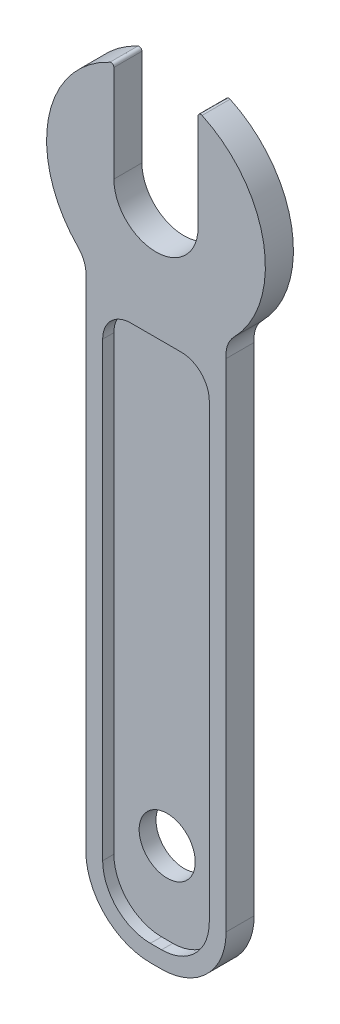
ISO-10303-21;
HEADER;
FILE_DESCRIPTION(('STEP AP214'),'2;1');
FILE_NAME('part.step','',(''),(''),'','','');
FILE_SCHEMA(('AUTOMOTIVE_DESIGN { 1 0 10303 214 1 1 1 1 }'));
ENDSEC;
DATA;
#1=APPLICATION_CONTEXT('core data for automotive mechanical design processes');
#2=APPLICATION_PROTOCOL_DEFINITION('international standard','automotive_design',2000,#1);
#3=PRODUCT_CONTEXT('',#1,'mechanical');
#4=PRODUCT('Part','Part','',(#3));
#5=PRODUCT_RELATED_PRODUCT_CATEGORY('part','',(#4));
#6=PRODUCT_DEFINITION_FORMATION('','',#4);
#7=PRODUCT_DEFINITION_CONTEXT('part definition',#1,'design');
#8=PRODUCT_DEFINITION('design','',#6,#7);
#9=PRODUCT_DEFINITION_SHAPE('','',#8);
#10=(LENGTH_UNIT() NAMED_UNIT(*) SI_UNIT(.MILLI.,.METRE.));
#11=(NAMED_UNIT(*) PLANE_ANGLE_UNIT() SI_UNIT($,.RADIAN.));
#12=(NAMED_UNIT(*) SI_UNIT($,.STERADIAN.) SOLID_ANGLE_UNIT());
#13=UNCERTAINTY_MEASURE_WITH_UNIT(LENGTH_MEASURE(1.E-05),#10,'distance_accuracy_value','');
#14=(GEOMETRIC_REPRESENTATION_CONTEXT(3) GLOBAL_UNCERTAINTY_ASSIGNED_CONTEXT((#13)) GLOBAL_UNIT_ASSIGNED_CONTEXT((#10,
#11,#12)) REPRESENTATION_CONTEXT('',''));
#15=CARTESIAN_POINT('',(0.,0.,0.));
#16=DIRECTION('',(0.,0.,1.));
#17=DIRECTION('',(1.,0.,0.));
#18=AXIS2_PLACEMENT_3D('',#15,#16,#17);
#19=CARTESIAN_POINT('',(25.,-76.9999999999998,10.));
#20=DIRECTION('',(-1.,0.,0.));
#21=DIRECTION('',(0.,0.,1.));
#22=AXIS2_PLACEMENT_3D('',#19,#20,#21);
#23=PLANE('',#22);
#24=DIRECTION('',(0.,1.,0.));
#25=VECTOR('',#24,1.);
#26=CARTESIAN_POINT('',(25.,-76.9999999999998,0.));
#27=LINE('',#26,#25);
#28=CARTESIAN_POINT('',(25.,-77.,0.));
#29=VERTEX_POINT('',#28);
#30=CARTESIAN_POINT('',(25.,100.,0.));
#31=VERTEX_POINT('',#30);
#32=EDGE_CURVE('E243',#29,#31,#27,.T.);
#33=ORIENTED_EDGE('',*,*,#32,.T.);
#34=DIRECTION('',(0.,0.,-1.));
#35=VECTOR('',#34,1.);
#36=CARTESIAN_POINT('',(25.,100.,10.));
#37=LINE('',#36,#35);
#38=CARTESIAN_POINT('',(25.,100.,10.));
#39=VERTEX_POINT('',#38);
#40=EDGE_CURVE('E338',#39,#31,#37,.T.);
#41=ORIENTED_EDGE('',*,*,#40,.F.);
#42=DIRECTION('',(0.,1.,0.));
#43=VECTOR('',#42,1.);
#44=CARTESIAN_POINT('',(25.,-76.9999999999998,10.));
#45=LINE('',#44,#43);
#46=CARTESIAN_POINT('',(25.,-77.,10.));
#47=VERTEX_POINT('',#46);
#48=EDGE_CURVE('E255',#47,#39,#45,.T.);
#49=ORIENTED_EDGE('',*,*,#48,.F.);
#50=DIRECTION('',(0.,0.,-1.));
#51=VECTOR('',#50,1.);
#52=CARTESIAN_POINT('',(25.,-77.,10.));
#53=LINE('',#52,#51);
#54=EDGE_CURVE('E281',#47,#29,#53,.T.);
#55=ORIENTED_EDGE('',*,*,#54,.T.);
#56=EDGE_LOOP('',(#33,#41,#49,#55));
#57=FACE_BOUND('',#56,.T.);
#58=ADVANCED_FACE('F34',(#57),#23,.F.);
#59=CARTESIAN_POINT('',(0.,135.407461889806,10.));
#60=DIRECTION('',(0.,0.,-1.));
#61=DIRECTION('',(-1.,0.,0.));
#62=AXIS2_PLACEMENT_3D('',#59,#60,#61);
#63=CYLINDRICAL_SURFACE('',#62,39.);
#64=CARTESIAN_POINT('',(0.,135.407461889806,10.));
#65=DIRECTION('',(0.,0.,1.));
#66=DIRECTION('',(1.,0.,0.));
#67=AXIS2_PLACEMENT_3D('',#64,#65,#66);
#68=CIRCLE('',#67,39.);
#69=CARTESIAN_POINT('',(27.8125159890148,108.067674868675,10.));
#70=VERTEX_POINT('',#69);
#71=CARTESIAN_POINT('',(16.4210526315789,170.781873976382,10.));
#72=VERTEX_POINT('',#71);
#73=EDGE_CURVE('E257',#70,#72,#68,.T.);
#74=ORIENTED_EDGE('',*,*,#73,.F.);
#75=DIRECTION('',(0.,0.,-1.));
#76=VECTOR('',#75,1.);
#77=CARTESIAN_POINT('',(27.8125159890148,108.067674868675,10.));
#78=LINE('',#77,#76);
#79=CARTESIAN_POINT('',(27.8125159890148,108.067674868675,0.));
#80=VERTEX_POINT('',#79);
#81=EDGE_CURVE('E343',#70,#80,#78,.T.);
#82=ORIENTED_EDGE('',*,*,#81,.T.);
#83=CARTESIAN_POINT('',(0.,135.407461889806,0.));
#84=DIRECTION('',(0.,0.,1.));
#85=DIRECTION('',(1.,0.,0.));
#86=AXIS2_PLACEMENT_3D('',#83,#84,#85);
#87=CIRCLE('',#86,39.);
#88=CARTESIAN_POINT('',(16.4210526315789,170.781873976382,0.));
#89=VERTEX_POINT('',#88);
#90=EDGE_CURVE('E284',#80,#89,#87,.T.);
#91=ORIENTED_EDGE('',*,*,#90,.T.);
#92=DIRECTION('',(0.,0.,-1.));
#93=VECTOR('',#92,1.);
#94=CARTESIAN_POINT('',(16.4210526315789,170.781873976382,10.));
#95=LINE('',#94,#93);
#96=EDGE_CURVE('E335',#72,#89,#95,.T.);
#97=ORIENTED_EDGE('',*,*,#96,.F.);
#98=EDGE_LOOP('',(#74,#82,#91,#97));
#99=FACE_BOUND('',#98,.T.);
#100=ADVANCED_FACE('F362',(#99),#63,.T.);
#101=CARTESIAN_POINT('',(16.,169.874837769034,10.));
#102=DIRECTION('',(0.,0.,-1.));
#103=DIRECTION('',(-1.,0.,0.));
#104=AXIS2_PLACEMENT_3D('',#101,#102,#103);
#105=CYLINDRICAL_SURFACE('',#104,1.);
#106=CARTESIAN_POINT('',(16.,169.874837769034,0.));
#107=DIRECTION('',(0.,0.,1.));
#108=DIRECTION('',(-1.,0.,0.));
#109=AXIS2_PLACEMENT_3D('',#106,#107,#108);
#110=CIRCLE('',#109,1.);
#111=CARTESIAN_POINT('',(15.,169.874837769034,0.));
#112=VERTEX_POINT('',#111);
#113=EDGE_CURVE('E286',#89,#112,#110,.T.);
#114=ORIENTED_EDGE('',*,*,#113,.T.);
#115=DIRECTION('',(0.,0.,-1.));
#116=VECTOR('',#115,1.);
#117=CARTESIAN_POINT('',(15.,169.874837769034,10.));
#118=LINE('',#117,#116);
#119=CARTESIAN_POINT('',(15.,169.874837769034,10.));
#120=VERTEX_POINT('',#119);
#121=EDGE_CURVE('E332',#120,#112,#118,.T.);
#122=ORIENTED_EDGE('',*,*,#121,.F.);
#123=CARTESIAN_POINT('',(16.,169.874837769034,10.));
#124=DIRECTION('',(0.,0.,1.));
#125=DIRECTION('',(-1.,0.,0.));
#126=AXIS2_PLACEMENT_3D('',#123,#124,#125);
#127=CIRCLE('',#126,1.);
#128=EDGE_CURVE('E260',#72,#120,#127,.T.);
#129=ORIENTED_EDGE('',*,*,#128,.F.);
#130=ORIENTED_EDGE('',*,*,#96,.T.);
#131=EDGE_LOOP('',(#114,#122,#129,#130));
#132=FACE_BOUND('',#131,.T.);
#133=ADVANCED_FACE('F370',(#132),#105,.T.);
#134=CARTESIAN_POINT('',(15.,135.407461889806,10.));
#135=DIRECTION('',(1.,0.,0.));
#136=DIRECTION('',(0.,0.,-1.));
#137=AXIS2_PLACEMENT_3D('',#134,#135,#136);
#138=PLANE('',#137);
#139=DIRECTION('',(0.,-1.,0.));
#140=VECTOR('',#139,1.);
#141=CARTESIAN_POINT('',(15.,135.407461889806,0.));
#142=LINE('',#141,#140);
#143=CARTESIAN_POINT('',(15.,135.407461889806,0.));
#144=VERTEX_POINT('',#143);
#145=EDGE_CURVE('E288',#112,#144,#142,.T.);
#146=ORIENTED_EDGE('',*,*,#145,.T.);
#147=DIRECTION('',(0.,0.,-1.));
#148=VECTOR('',#147,1.);
#149=CARTESIAN_POINT('',(15.,135.407461889806,10.));
#150=LINE('',#149,#148);
#151=CARTESIAN_POINT('',(15.,135.407461889806,10.));
#152=VERTEX_POINT('',#151);
#153=EDGE_CURVE('E329',#152,#144,#150,.T.);
#154=ORIENTED_EDGE('',*,*,#153,.F.);
#155=DIRECTION('',(0.,-1.,0.));
#156=VECTOR('',#155,1.);
#157=CARTESIAN_POINT('',(15.,135.407461889806,10.));
#158=LINE('',#157,#156);
#159=EDGE_CURVE('E262',#120,#152,#158,.T.);
#160=ORIENTED_EDGE('',*,*,#159,.F.);
#161=ORIENTED_EDGE('',*,*,#121,.T.);
#162=EDGE_LOOP('',(#146,#154,#160,#161));
#163=FACE_BOUND('',#162,.T.);
#164=ADVANCED_FACE('F373',(#163),#138,.F.);
#165=CARTESIAN_POINT('',(0.,135.407461889806,10.));
#166=DIRECTION('',(0.,0.,-1.));
#167=DIRECTION('',(-1.,0.,0.));
#168=AXIS2_PLACEMENT_3D('',#165,#166,#167);
#169=CYLINDRICAL_SURFACE('',#168,15.);
#170=CARTESIAN_POINT('',(0.,135.407461889806,0.));
#171=DIRECTION('',(0.,0.,-1.));
#172=DIRECTION('',(1.,0.,0.));
#173=AXIS2_PLACEMENT_3D('',#170,#171,#172);
#174=CIRCLE('',#173,15.);
#175=CARTESIAN_POINT('',(-15.,135.407461889806,0.));
#176=VERTEX_POINT('',#175);
#177=EDGE_CURVE('E290',#144,#176,#174,.T.);
#178=ORIENTED_EDGE('',*,*,#177,.T.);
#179=DIRECTION('',(0.,0.,-1.));
#180=VECTOR('',#179,1.);
#181=CARTESIAN_POINT('',(-15.,135.407461889806,10.));
#182=LINE('',#181,#180);
#183=CARTESIAN_POINT('',(-15.,135.407461889806,10.));
#184=VERTEX_POINT('',#183);
#185=EDGE_CURVE('E326',#184,#176,#182,.T.);
#186=ORIENTED_EDGE('',*,*,#185,.F.);
#187=CARTESIAN_POINT('',(0.,135.407461889806,10.));
#188=DIRECTION('',(0.,0.,-1.));
#189=DIRECTION('',(1.,0.,0.));
#190=AXIS2_PLACEMENT_3D('',#187,#188,#189);
#191=CIRCLE('',#190,15.);
#192=EDGE_CURVE('E264',#152,#184,#191,.T.);
#193=ORIENTED_EDGE('',*,*,#192,.F.);
#194=ORIENTED_EDGE('',*,*,#153,.T.);
#195=EDGE_LOOP('',(#178,#186,#193,#194));
#196=FACE_BOUND('',#195,.T.);
#197=ADVANCED_FACE('F378',(#196),#169,.F.);
#198=CARTESIAN_POINT('',(-15.,135.407461889806,10.));
#199=DIRECTION('',(-1.,0.,0.));
#200=DIRECTION('',(0.,0.,1.));
#201=AXIS2_PLACEMENT_3D('',#198,#199,#200);
#202=PLANE('',#201);
#203=DIRECTION('',(0.,1.,0.));
#204=VECTOR('',#203,1.);
#205=CARTESIAN_POINT('',(-15.,135.407461889806,0.));
#206=LINE('',#205,#204);
#207=CARTESIAN_POINT('',(-15.,169.874837769034,0.));
#208=VERTEX_POINT('',#207);
#209=EDGE_CURVE('E292',#176,#208,#206,.T.);
#210=ORIENTED_EDGE('',*,*,#209,.T.);
#211=DIRECTION('',(0.,0.,-1.));
#212=VECTOR('',#211,1.);
#213=CARTESIAN_POINT('',(-15.,169.874837769034,10.));
#214=LINE('',#213,#212);
#215=CARTESIAN_POINT('',(-15.,169.874837769034,10.));
#216=VERTEX_POINT('',#215);
#217=EDGE_CURVE('E323',#216,#208,#214,.T.);
#218=ORIENTED_EDGE('',*,*,#217,.F.);
#219=DIRECTION('',(0.,1.,0.));
#220=VECTOR('',#219,1.);
#221=CARTESIAN_POINT('',(-15.,135.407461889806,10.));
#222=LINE('',#221,#220);
#223=EDGE_CURVE('E266',#184,#216,#222,.T.);
#224=ORIENTED_EDGE('',*,*,#223,.F.);
#225=ORIENTED_EDGE('',*,*,#185,.T.);
#226=EDGE_LOOP('',(#210,#218,#224,#225));
#227=FACE_BOUND('',#226,.T.);
#228=ADVANCED_FACE('F384',(#227),#202,.F.);
#229=CARTESIAN_POINT('',(-16.,169.874837769034,10.));
#230=DIRECTION('',(0.,0.,-1.));
#231=DIRECTION('',(-1.,0.,0.));
#232=AXIS2_PLACEMENT_3D('',#229,#230,#231);
#233=CYLINDRICAL_SURFACE('',#232,1.);
#234=CARTESIAN_POINT('',(-16.,169.874837769034,0.));
#235=DIRECTION('',(0.,0.,1.));
#236=DIRECTION('',(1.,0.,0.));
#237=AXIS2_PLACEMENT_3D('',#234,#235,#236);
#238=CIRCLE('',#237,1.);
#239=CARTESIAN_POINT('',(-16.421052631579,170.781873976382,0.));
#240=VERTEX_POINT('',#239);
#241=EDGE_CURVE('E294',#208,#240,#238,.T.);
#242=ORIENTED_EDGE('',*,*,#241,.T.);
#243=DIRECTION('',(0.,0.,-1.));
#244=VECTOR('',#243,1.);
#245=CARTESIAN_POINT('',(-16.421052631579,170.781873976382,10.));
#246=LINE('',#245,#244);
#247=CARTESIAN_POINT('',(-16.421052631579,170.781873976382,10.));
#248=VERTEX_POINT('',#247);
#249=EDGE_CURVE('E320',#248,#240,#246,.T.);
#250=ORIENTED_EDGE('',*,*,#249,.F.);
#251=CARTESIAN_POINT('',(-16.,169.874837769034,10.));
#252=DIRECTION('',(0.,0.,1.));
#253=DIRECTION('',(1.,0.,0.));
#254=AXIS2_PLACEMENT_3D('',#251,#252,#253);
#255=CIRCLE('',#254,1.);
#256=EDGE_CURVE('E268',#216,#248,#255,.T.);
#257=ORIENTED_EDGE('',*,*,#256,.F.);
#258=ORIENTED_EDGE('',*,*,#217,.T.);
#259=EDGE_LOOP('',(#242,#250,#257,#258));
#260=FACE_BOUND('',#259,.T.);
#261=ADVANCED_FACE('F388',(#260),#233,.T.);
#262=CARTESIAN_POINT('',(0.,135.407461889806,10.));
#263=DIRECTION('',(0.,0.,-1.));
#264=DIRECTION('',(-1.,0.,0.));
#265=AXIS2_PLACEMENT_3D('',#262,#263,#264);
#266=CYLINDRICAL_SURFACE('',#265,39.);
#267=CARTESIAN_POINT('',(0.,135.407461889806,0.));
#268=DIRECTION('',(0.,0.,1.));
#269=DIRECTION('',(1.,0.,0.));
#270=AXIS2_PLACEMENT_3D('',#267,#268,#269);
#271=CIRCLE('',#270,39.);
#272=CARTESIAN_POINT('',(-27.8125159890148,108.067674868675,0.));
#273=VERTEX_POINT('',#272);
#274=EDGE_CURVE('E296',#240,#273,#271,.T.);
#275=ORIENTED_EDGE('',*,*,#274,.T.);
#276=DIRECTION('',(0.,0.,-1.));
#277=VECTOR('',#276,1.);
#278=CARTESIAN_POINT('',(-27.8125159890148,108.067674868675,10.));
#279=LINE('',#278,#277);
#280=CARTESIAN_POINT('',(-27.8125159890148,108.067674868675,10.));
#281=VERTEX_POINT('',#280);
#282=EDGE_CURVE('E341',#273,#281,#279,.F.);
#283=ORIENTED_EDGE('',*,*,#282,.T.);
#284=CARTESIAN_POINT('',(0.,135.407461889806,10.));
#285=DIRECTION('',(0.,0.,1.));
#286=DIRECTION('',(1.,0.,0.));
#287=AXIS2_PLACEMENT_3D('',#284,#285,#286);
#288=CIRCLE('',#287,39.);
#289=EDGE_CURVE('E270',#248,#281,#288,.T.);
#290=ORIENTED_EDGE('',*,*,#289,.F.);
#291=ORIENTED_EDGE('',*,*,#249,.T.);
#292=EDGE_LOOP('',(#275,#283,#290,#291));
#293=FACE_BOUND('',#292,.T.);
#294=ADVANCED_FACE('F392',(#293),#266,.T.);
#295=CARTESIAN_POINT('',(-25.,-76.9999999999998,10.));
#296=DIRECTION('',(1.,0.,0.));
#297=DIRECTION('',(0.,0.,-1.));
#298=AXIS2_PLACEMENT_3D('',#295,#296,#297);
#299=PLANE('',#298);
#300=DIRECTION('',(0.,-1.,0.));
#301=VECTOR('',#300,1.);
#302=CARTESIAN_POINT('',(-25.,-76.9999999999998,0.));
#303=LINE('',#302,#301);
#304=CARTESIAN_POINT('',(-25.,100.,0.));
#305=VERTEX_POINT('',#304);
#306=CARTESIAN_POINT('',(-25.,-76.9999999999998,0.));
#307=VERTEX_POINT('',#306);
#308=EDGE_CURVE('E299',#305,#307,#303,.T.);
#309=ORIENTED_EDGE('',*,*,#308,.T.);
#310=DIRECTION('',(0.,0.,-1.));
#311=VECTOR('',#310,1.);
#312=CARTESIAN_POINT('',(-25.,-76.9999999999998,10.));
#313=LINE('',#312,#311);
#314=CARTESIAN_POINT('',(-25.,-76.9999999999998,10.));
#315=VERTEX_POINT('',#314);
#316=EDGE_CURVE('E314',#315,#307,#313,.T.);
#317=ORIENTED_EDGE('',*,*,#316,.F.);
#318=DIRECTION('',(0.,-1.,0.));
#319=VECTOR('',#318,1.);
#320=CARTESIAN_POINT('',(-25.,-76.9999999999998,10.));
#321=LINE('',#320,#319);
#322=CARTESIAN_POINT('',(-25.,100.,10.));
#323=VERTEX_POINT('',#322);
#324=EDGE_CURVE('E273',#323,#315,#321,.T.);
#325=ORIENTED_EDGE('',*,*,#324,.F.);
#326=DIRECTION('',(0.,0.,-1.));
#327=VECTOR('',#326,1.);
#328=CARTESIAN_POINT('',(-25.,100.,10.));
#329=LINE('',#328,#327);
#330=EDGE_CURVE('E317',#323,#305,#329,.T.);
#331=ORIENTED_EDGE('',*,*,#330,.T.);
#332=EDGE_LOOP('',(#309,#317,#325,#331));
#333=FACE_BOUND('',#332,.T.);
#334=ADVANCED_FACE('F401',(#333),#299,.F.);
#335=CARTESIAN_POINT('',(-2.,-77.,10.));
#336=DIRECTION('',(0.,0.,-1.));
#337=DIRECTION('',(-1.,0.,0.));
#338=AXIS2_PLACEMENT_3D('',#335,#336,#337);
#339=CYLINDRICAL_SURFACE('',#338,23.);
#340=CARTESIAN_POINT('',(-2.,-77.,0.));
#341=DIRECTION('',(0.,0.,1.));
#342=DIRECTION('',(-1.,0.,0.));
#343=AXIS2_PLACEMENT_3D('',#340,#341,#342);
#344=CIRCLE('',#343,23.);
#345=CARTESIAN_POINT('',(-1.99999999999983,-100.,0.));
#346=VERTEX_POINT('',#345);
#347=EDGE_CURVE('E301',#307,#346,#344,.T.);
#348=ORIENTED_EDGE('',*,*,#347,.T.);
#349=DIRECTION('',(0.,0.,-1.));
#350=VECTOR('',#349,1.);
#351=CARTESIAN_POINT('',(-1.99999999999983,-100.,10.));
#352=LINE('',#351,#350);
#353=CARTESIAN_POINT('',(-1.99999999999983,-100.,10.));
#354=VERTEX_POINT('',#353);
#355=EDGE_CURVE('E311',#354,#346,#352,.T.);
#356=ORIENTED_EDGE('',*,*,#355,.F.);
#357=CARTESIAN_POINT('',(-2.,-77.,10.));
#358=DIRECTION('',(0.,0.,1.));
#359=DIRECTION('',(-1.,0.,0.));
#360=AXIS2_PLACEMENT_3D('',#357,#358,#359);
#361=CIRCLE('',#360,23.);
#362=EDGE_CURVE('E275',#315,#354,#361,.T.);
#363=ORIENTED_EDGE('',*,*,#362,.F.);
#364=ORIENTED_EDGE('',*,*,#316,.T.);
#365=EDGE_LOOP('',(#348,#356,#363,#364));
#366=FACE_BOUND('',#365,.T.);
#367=ADVANCED_FACE('F407',(#366),#339,.T.);
#368=CARTESIAN_POINT('',(-1.99999999999984,-100.,10.));
#369=DIRECTION('',(0.,1.,0.));
#370=DIRECTION('',(0.,0.,1.));
#371=AXIS2_PLACEMENT_3D('',#368,#369,#370);
#372=PLANE('',#371);
#373=DIRECTION('',(1.,0.,0.));
#374=VECTOR('',#373,1.);
#375=CARTESIAN_POINT('',(-1.99999999999984,-100.,0.));
#376=LINE('',#375,#374);
#377=CARTESIAN_POINT('',(1.99999999999984,-100.,0.));
#378=VERTEX_POINT('',#377);
#379=EDGE_CURVE('E303',#346,#378,#376,.T.);
#380=ORIENTED_EDGE('',*,*,#379,.T.);
#381=DIRECTION('',(0.,0.,-1.));
#382=VECTOR('',#381,1.);
#383=CARTESIAN_POINT('',(1.99999999999984,-100.,10.));
#384=LINE('',#383,#382);
#385=CARTESIAN_POINT('',(1.99999999999984,-100.,10.));
#386=VERTEX_POINT('',#385);
#387=EDGE_CURVE('E308',#386,#378,#384,.T.);
#388=ORIENTED_EDGE('',*,*,#387,.F.);
#389=DIRECTION('',(1.,0.,0.));
#390=VECTOR('',#389,1.);
#391=CARTESIAN_POINT('',(-1.99999999999984,-100.,10.));
#392=LINE('',#391,#390);
#393=EDGE_CURVE('E277',#354,#386,#392,.T.);
#394=ORIENTED_EDGE('',*,*,#393,.F.);
#395=ORIENTED_EDGE('',*,*,#355,.T.);
#396=EDGE_LOOP('',(#380,#388,#394,#395));
#397=FACE_BOUND('',#396,.T.);
#398=ADVANCED_FACE('F411',(#397),#372,.F.);
#399=CARTESIAN_POINT('',(2.,-77.,10.));
#400=DIRECTION('',(0.,0.,-1.));
#401=DIRECTION('',(-1.,0.,0.));
#402=AXIS2_PLACEMENT_3D('',#399,#400,#401);
#403=CYLINDRICAL_SURFACE('',#402,23.);
#404=CARTESIAN_POINT('',(2.,-77.,0.));
#405=DIRECTION('',(0.,0.,1.));
#406=DIRECTION('',(1.,0.,0.));
#407=AXIS2_PLACEMENT_3D('',#404,#405,#406);
#408=CIRCLE('',#407,23.);
#409=EDGE_CURVE('E258',#378,#29,#408,.T.);
#410=ORIENTED_EDGE('',*,*,#409,.T.);
#411=ORIENTED_EDGE('',*,*,#54,.F.);
#412=CARTESIAN_POINT('',(2.,-77.,10.));
#413=DIRECTION('',(0.,0.,1.));
#414=DIRECTION('',(1.,0.,0.));
#415=AXIS2_PLACEMENT_3D('',#412,#413,#414);
#416=CIRCLE('',#415,23.);
#417=EDGE_CURVE('E279',#386,#47,#416,.T.);
#418=ORIENTED_EDGE('',*,*,#417,.F.);
#419=ORIENTED_EDGE('',*,*,#387,.T.);
#420=EDGE_LOOP('',(#410,#411,#418,#419));
#421=FACE_BOUND('',#420,.T.);
#422=ADVANCED_FACE('F415',(#421),#403,.T.);
#423=CARTESIAN_POINT('',(0.,135.407461889806,10.));
#424=DIRECTION('',(0.,0.,1.));
#425=DIRECTION('',(1.,0.,0.));
#426=AXIS2_PLACEMENT_3D('',#423,#424,#425);
#427=PLANE('',#426);
#428=CARTESIAN_POINT('',(9.,84.,10.));
#429=DIRECTION('',(0.,0.,1.));
#430=DIRECTION('',(-1.,0.,0.));
#431=AXIS2_PLACEMENT_3D('',#428,#429,#430);
#432=CIRCLE('',#431,10.);
#433=CARTESIAN_POINT('',(19.,83.9999999999999,10.));
#434=VERTEX_POINT('',#433);
#435=CARTESIAN_POINT('',(8.99999999999993,94.,10.));
#436=VERTEX_POINT('',#435);
#437=EDGE_CURVE('E49',#434,#436,#432,.T.);
#438=ORIENTED_EDGE('',*,*,#437,.F.);
#439=DIRECTION('',(0.,1.,0.));
#440=VECTOR('',#439,1.);
#441=CARTESIAN_POINT('',(19.,-76.9999999999999,10.));
#442=LINE('',#441,#440);
#443=CARTESIAN_POINT('',(19.,-77.,10.));
#444=VERTEX_POINT('',#443);
#445=EDGE_CURVE('E202',#444,#434,#442,.T.);
#446=ORIENTED_EDGE('',*,*,#445,.F.);
#447=CARTESIAN_POINT('',(2.,-77.,10.));
#448=DIRECTION('',(0.,0.,1.));
#449=DIRECTION('',(1.,0.,0.));
#450=AXIS2_PLACEMENT_3D('',#447,#448,#449);
#451=CIRCLE('',#450,17.);
#452=CARTESIAN_POINT('',(1.99999999999988,-94.,10.));
#453=VERTEX_POINT('',#452);
#454=EDGE_CURVE('E205',#453,#444,#451,.T.);
#455=ORIENTED_EDGE('',*,*,#454,.F.);
#456=DIRECTION('',(1.,0.,0.));
#457=VECTOR('',#456,1.);
#458=CARTESIAN_POINT('',(-1.99999999999988,-94.,10.));
#459=LINE('',#458,#457);
#460=CARTESIAN_POINT('',(-1.99999999999987,-94.,10.));
#461=VERTEX_POINT('',#460);
#462=EDGE_CURVE('E236',#461,#453,#459,.T.);
#463=ORIENTED_EDGE('',*,*,#462,.F.);
#464=CARTESIAN_POINT('',(-2.,-77.,10.));
#465=DIRECTION('',(0.,0.,1.));
#466=DIRECTION('',(-1.,0.,0.));
#467=AXIS2_PLACEMENT_3D('',#464,#465,#466);
#468=CIRCLE('',#467,17.);
#469=CARTESIAN_POINT('',(-19.,-76.9999999999999,10.));
#470=VERTEX_POINT('',#469);
#471=EDGE_CURVE('E233',#470,#461,#468,.T.);
#472=ORIENTED_EDGE('',*,*,#471,.F.);
#473=DIRECTION('',(0.,-1.,0.));
#474=VECTOR('',#473,1.);
#475=CARTESIAN_POINT('',(-19.,-76.9999999999999,10.));
#476=LINE('',#475,#474);
#477=CARTESIAN_POINT('',(-19.,83.9999999999999,10.));
#478=VERTEX_POINT('',#477);
#479=EDGE_CURVE('E230',#478,#470,#476,.T.);
#480=ORIENTED_EDGE('',*,*,#479,.F.);
#481=CARTESIAN_POINT('',(-9.,84.,10.));
#482=DIRECTION('',(0.,0.,1.));
#483=DIRECTION('',(-1.,0.,0.));
#484=AXIS2_PLACEMENT_3D('',#481,#482,#483);
#485=CIRCLE('',#484,10.);
#486=CARTESIAN_POINT('',(-8.99999999999993,94.,10.));
#487=VERTEX_POINT('',#486);
#488=EDGE_CURVE('E227',#487,#478,#485,.T.);
#489=ORIENTED_EDGE('',*,*,#488,.F.);
#490=DIRECTION('',(-1.,0.,0.));
#491=VECTOR('',#490,1.);
#492=CARTESIAN_POINT('',(-8.99999999999993,94.,10.));
#493=LINE('',#492,#491);
#494=EDGE_CURVE('E225',#436,#487,#493,.T.);
#495=ORIENTED_EDGE('',*,*,#494,.F.);
#496=EDGE_LOOP('',(#438,#446,#455,#463,#472,#480,#489,#495));
#497=FACE_BOUND('',#496,.T.);
#498=ORIENTED_EDGE('',*,*,#48,.T.);
#499=CARTESIAN_POINT('',(34.9439303451724,101.057473068385,10.));
#500=DIRECTION('',(0.,0.,1.));
#501=DIRECTION('',(1.,0.,0.));
#502=AXIS2_PLACEMENT_3D('',#499,#500,#501);
#503=CIRCLE('',#502,10.);
#504=EDGE_CURVE('E11',#39,#70,#503,.F.);
#505=ORIENTED_EDGE('',*,*,#504,.T.);
#506=ORIENTED_EDGE('',*,*,#73,.T.);
#507=ORIENTED_EDGE('',*,*,#128,.T.);
#508=ORIENTED_EDGE('',*,*,#159,.T.);
#509=ORIENTED_EDGE('',*,*,#192,.T.);
#510=ORIENTED_EDGE('',*,*,#223,.T.);
#511=ORIENTED_EDGE('',*,*,#256,.T.);
#512=ORIENTED_EDGE('',*,*,#289,.T.);
#513=CARTESIAN_POINT('',(-34.9439303451724,101.057473068385,10.));
#514=DIRECTION('',(0.,0.,1.));
#515=DIRECTION('',(1.,0.,0.));
#516=AXIS2_PLACEMENT_3D('',#513,#514,#515);
#517=CIRCLE('',#516,10.);
#518=EDGE_CURVE('E348',#281,#323,#517,.F.);
#519=ORIENTED_EDGE('',*,*,#518,.T.);
#520=ORIENTED_EDGE('',*,*,#324,.T.);
#521=ORIENTED_EDGE('',*,*,#362,.T.);
#522=ORIENTED_EDGE('',*,*,#393,.T.);
#523=ORIENTED_EDGE('',*,*,#417,.T.);
#524=EDGE_LOOP('',(#498,#505,#506,#507,#508,#509,#510,#511,#512,#519,#520,#521,#522,#523));
#525=FACE_BOUND('',#524,.T.);
#526=ADVANCED_FACE('F365',(#497,#525),#427,.T.);
#527=CARTESIAN_POINT('',(0.,135.407461889806,0.));
#528=DIRECTION('',(0.,0.,1.));
#529=DIRECTION('',(1.,0.,0.));
#530=AXIS2_PLACEMENT_3D('',#527,#528,#529);
#531=PLANE('',#530);
#532=CARTESIAN_POINT('',(0.,-64.903172803402,0.));
#533=DIRECTION('',(0.,0.,1.));
#534=DIRECTION('',(1.,0.,0.));
#535=AXIS2_PLACEMENT_3D('',#532,#533,#534);
#536=CIRCLE('',#535,10.);
#537=CARTESIAN_POINT('',(10.,-64.903172803402,0.));
#538=VERTEX_POINT('',#537);
#539=EDGE_CURVE('E208',#538,#538,#536,.T.);
#540=ORIENTED_EDGE('',*,*,#539,.T.);
#541=EDGE_LOOP('',(#540));
#542=FACE_BOUND('',#541,.T.);
#543=ORIENTED_EDGE('',*,*,#32,.F.);
#544=ORIENTED_EDGE('',*,*,#409,.F.);
#545=ORIENTED_EDGE('',*,*,#379,.F.);
#546=ORIENTED_EDGE('',*,*,#347,.F.);
#547=ORIENTED_EDGE('',*,*,#308,.F.);
#548=CARTESIAN_POINT('',(-34.9439303451724,101.057473068385,0.));
#549=DIRECTION('',(0.,0.,1.));
#550=DIRECTION('',(1.,0.,0.));
#551=AXIS2_PLACEMENT_3D('',#548,#549,#550);
#552=CIRCLE('',#551,10.);
#553=EDGE_CURVE('E346',#305,#273,#552,.T.);
#554=ORIENTED_EDGE('',*,*,#553,.T.);
#555=ORIENTED_EDGE('',*,*,#274,.F.);
#556=ORIENTED_EDGE('',*,*,#241,.F.);
#557=ORIENTED_EDGE('',*,*,#209,.F.);
#558=ORIENTED_EDGE('',*,*,#177,.F.);
#559=ORIENTED_EDGE('',*,*,#145,.F.);
#560=ORIENTED_EDGE('',*,*,#113,.F.);
#561=ORIENTED_EDGE('',*,*,#90,.F.);
#562=CARTESIAN_POINT('',(34.9439303451724,101.057473068385,0.));
#563=DIRECTION('',(0.,0.,1.));
#564=DIRECTION('',(1.,0.,0.));
#565=AXIS2_PLACEMENT_3D('',#562,#563,#564);
#566=CIRCLE('',#565,10.);
#567=EDGE_CURVE('E42',#80,#31,#566,.T.);
#568=ORIENTED_EDGE('',*,*,#567,.T.);
#569=EDGE_LOOP('',(#543,#544,#545,#546,#547,#554,#555,#556,#557,#558,#559,#560,#561,#568));
#570=FACE_BOUND('',#569,.T.);
#571=ADVANCED_FACE('F352',(#542,#570),#531,.F.);
#572=CARTESIAN_POINT('',(-34.9439303451724,101.057473068385,10.));
#573=DIRECTION('',(0.,0.,1.));
#574=DIRECTION('',(1.,0.,0.));
#575=AXIS2_PLACEMENT_3D('',#572,#573,#574);
#576=CYLINDRICAL_SURFACE('',#575,10.);
#577=ORIENTED_EDGE('',*,*,#518,.F.);
#578=ORIENTED_EDGE('',*,*,#282,.F.);
#579=ORIENTED_EDGE('',*,*,#553,.F.);
#580=ORIENTED_EDGE('',*,*,#330,.F.);
#581=EDGE_LOOP('',(#577,#578,#579,#580));
#582=FACE_BOUND('',#581,.T.);
#583=ADVANCED_FACE('F398',(#582),#576,.F.);
#584=CARTESIAN_POINT('',(34.9439303451724,101.057473068385,10.));
#585=DIRECTION('',(0.,0.,1.));
#586=DIRECTION('',(1.,0.,0.));
#587=AXIS2_PLACEMENT_3D('',#584,#585,#586);
#588=CYLINDRICAL_SURFACE('',#587,10.);
#589=ORIENTED_EDGE('',*,*,#504,.F.);
#590=ORIENTED_EDGE('',*,*,#40,.T.);
#591=ORIENTED_EDGE('',*,*,#567,.F.);
#592=ORIENTED_EDGE('',*,*,#81,.F.);
#593=EDGE_LOOP('',(#589,#590,#591,#592));
#594=FACE_BOUND('',#593,.T.);
#595=ADVANCED_FACE('F36',(#594),#588,.F.);
#596=CARTESIAN_POINT('',(9.,84.,6.));
#597=DIRECTION('',(0.,0.,1.));
#598=DIRECTION('',(1.,0.,0.));
#599=AXIS2_PLACEMENT_3D('',#596,#597,#598);
#600=CYLINDRICAL_SURFACE('',#599,10.);
#601=ORIENTED_EDGE('',*,*,#437,.T.);
#602=DIRECTION('',(0.,0.,1.));
#603=VECTOR('',#602,1.);
#604=CARTESIAN_POINT('',(8.99999999999993,94.,6.));
#605=LINE('',#604,#603);
#606=CARTESIAN_POINT('',(8.99999999999993,94.,6.));
#607=VERTEX_POINT('',#606);
#608=EDGE_CURVE('E179',#607,#436,#605,.T.);
#609=ORIENTED_EDGE('',*,*,#608,.F.);
#610=CARTESIAN_POINT('',(9.,84.,6.));
#611=DIRECTION('',(0.,0.,1.));
#612=DIRECTION('',(-1.,0.,0.));
#613=AXIS2_PLACEMENT_3D('',#610,#611,#612);
#614=CIRCLE('',#613,10.);
#615=CARTESIAN_POINT('',(19.,83.9999999999999,6.));
#616=VERTEX_POINT('',#615);
#617=EDGE_CURVE('E183',#616,#607,#614,.T.);
#618=ORIENTED_EDGE('',*,*,#617,.F.);
#619=DIRECTION('',(0.,0.,1.));
#620=VECTOR('',#619,1.);
#621=CARTESIAN_POINT('',(19.,83.9999999999999,6.));
#622=LINE('',#621,#620);
#623=EDGE_CURVE('E241',#616,#434,#622,.T.);
#624=ORIENTED_EDGE('',*,*,#623,.T.);
#625=EDGE_LOOP('',(#601,#609,#618,#624));
#626=FACE_BOUND('',#625,.T.);
#627=ADVANCED_FACE('F181',(#626),#600,.F.);
#628=CARTESIAN_POINT('',(19.,-76.9999999999999,6.));
#629=DIRECTION('',(1.,0.,0.));
#630=DIRECTION('',(0.,0.,-1.));
#631=AXIS2_PLACEMENT_3D('',#628,#629,#630);
#632=PLANE('',#631);
#633=ORIENTED_EDGE('',*,*,#445,.T.);
#634=ORIENTED_EDGE('',*,*,#623,.F.);
#635=DIRECTION('',(0.,1.,0.));
#636=VECTOR('',#635,1.);
#637=CARTESIAN_POINT('',(19.,-76.9999999999999,6.));
#638=LINE('',#637,#636);
#639=CARTESIAN_POINT('',(19.,-77.,6.));
#640=VERTEX_POINT('',#639);
#641=EDGE_CURVE('E189',#640,#616,#638,.T.);
#642=ORIENTED_EDGE('',*,*,#641,.F.);
#643=DIRECTION('',(0.,0.,1.));
#644=VECTOR('',#643,1.);
#645=CARTESIAN_POINT('',(19.,-77.,6.));
#646=LINE('',#645,#644);
#647=EDGE_CURVE('E244',#640,#444,#646,.T.);
#648=ORIENTED_EDGE('',*,*,#647,.T.);
#649=EDGE_LOOP('',(#633,#634,#642,#648));
#650=FACE_BOUND('',#649,.T.);
#651=ADVANCED_FACE('F445',(#650),#632,.F.);
#652=CARTESIAN_POINT('',(2.,-77.,6.));
#653=DIRECTION('',(0.,0.,1.));
#654=DIRECTION('',(1.,0.,0.));
#655=AXIS2_PLACEMENT_3D('',#652,#653,#654);
#656=CYLINDRICAL_SURFACE('',#655,17.);
#657=ORIENTED_EDGE('',*,*,#454,.T.);
#658=ORIENTED_EDGE('',*,*,#647,.F.);
#659=CARTESIAN_POINT('',(2.,-77.,6.));
#660=DIRECTION('',(0.,0.,1.));
#661=DIRECTION('',(1.,0.,0.));
#662=AXIS2_PLACEMENT_3D('',#659,#660,#661);
#663=CIRCLE('',#662,17.);
#664=CARTESIAN_POINT('',(1.99999999999988,-94.,6.));
#665=VERTEX_POINT('',#664);
#666=EDGE_CURVE('E221',#665,#640,#663,.T.);
#667=ORIENTED_EDGE('',*,*,#666,.F.);
#668=DIRECTION('',(0.,0.,1.));
#669=VECTOR('',#668,1.);
#670=CARTESIAN_POINT('',(1.99999999999988,-94.,6.));
#671=LINE('',#670,#669);
#672=EDGE_CURVE('E246',#665,#453,#671,.T.);
#673=ORIENTED_EDGE('',*,*,#672,.T.);
#674=EDGE_LOOP('',(#657,#658,#667,#673));
#675=FACE_BOUND('',#674,.T.);
#676=ADVANCED_FACE('F463',(#675),#656,.F.);
#677=CARTESIAN_POINT('',(-1.99999999999988,-94.,6.));
#678=DIRECTION('',(0.,-1.,0.));
#679=DIRECTION('',(0.,0.,-1.));
#680=AXIS2_PLACEMENT_3D('',#677,#678,#679);
#681=PLANE('',#680);
#682=ORIENTED_EDGE('',*,*,#462,.T.);
#683=ORIENTED_EDGE('',*,*,#672,.F.);
#684=DIRECTION('',(1.,0.,0.));
#685=VECTOR('',#684,1.);
#686=CARTESIAN_POINT('',(-1.99999999999988,-94.,6.));
#687=LINE('',#686,#685);
#688=CARTESIAN_POINT('',(-1.99999999999987,-94.,6.));
#689=VERTEX_POINT('',#688);
#690=EDGE_CURVE('E218',#689,#665,#687,.T.);
#691=ORIENTED_EDGE('',*,*,#690,.F.);
#692=DIRECTION('',(0.,0.,1.));
#693=VECTOR('',#692,1.);
#694=CARTESIAN_POINT('',(-1.99999999999987,-94.,6.));
#695=LINE('',#694,#693);
#696=EDGE_CURVE('E248',#689,#461,#695,.T.);
#697=ORIENTED_EDGE('',*,*,#696,.T.);
#698=EDGE_LOOP('',(#682,#683,#691,#697));
#699=FACE_BOUND('',#698,.T.);
#700=ADVANCED_FACE('F459',(#699),#681,.F.);
#701=CARTESIAN_POINT('',(-2.,-77.,6.));
#702=DIRECTION('',(0.,0.,1.));
#703=DIRECTION('',(1.,0.,0.));
#704=AXIS2_PLACEMENT_3D('',#701,#702,#703);
#705=CYLINDRICAL_SURFACE('',#704,17.);
#706=ORIENTED_EDGE('',*,*,#471,.T.);
#707=ORIENTED_EDGE('',*,*,#696,.F.);
#708=CARTESIAN_POINT('',(-2.,-77.,6.));
#709=DIRECTION('',(0.,0.,1.));
#710=DIRECTION('',(-1.,0.,0.));
#711=AXIS2_PLACEMENT_3D('',#708,#709,#710);
#712=CIRCLE('',#711,17.);
#713=CARTESIAN_POINT('',(-19.,-76.9999999999999,6.));
#714=VERTEX_POINT('',#713);
#715=EDGE_CURVE('E215',#714,#689,#712,.T.);
#716=ORIENTED_EDGE('',*,*,#715,.F.);
#717=DIRECTION('',(0.,0.,1.));
#718=VECTOR('',#717,1.);
#719=CARTESIAN_POINT('',(-19.,-76.9999999999999,6.));
#720=LINE('',#719,#718);
#721=EDGE_CURVE('E250',#714,#470,#720,.T.);
#722=ORIENTED_EDGE('',*,*,#721,.T.);
#723=EDGE_LOOP('',(#706,#707,#716,#722));
#724=FACE_BOUND('',#723,.T.);
#725=ADVANCED_FACE('F455',(#724),#705,.F.);
#726=CARTESIAN_POINT('',(-19.,-76.9999999999999,6.));
#727=DIRECTION('',(-1.,0.,0.));
#728=DIRECTION('',(0.,0.,1.));
#729=AXIS2_PLACEMENT_3D('',#726,#727,#728);
#730=PLANE('',#729);
#731=ORIENTED_EDGE('',*,*,#479,.T.);
#732=ORIENTED_EDGE('',*,*,#721,.F.);
#733=DIRECTION('',(0.,-1.,0.));
#734=VECTOR('',#733,1.);
#735=CARTESIAN_POINT('',(-19.,-76.9999999999999,6.));
#736=LINE('',#735,#734);
#737=CARTESIAN_POINT('',(-19.,83.9999999999999,6.));
#738=VERTEX_POINT('',#737);
#739=EDGE_CURVE('E212',#738,#714,#736,.T.);
#740=ORIENTED_EDGE('',*,*,#739,.F.);
#741=DIRECTION('',(0.,0.,1.));
#742=VECTOR('',#741,1.);
#743=CARTESIAN_POINT('',(-19.,83.9999999999999,6.));
#744=LINE('',#743,#742);
#745=EDGE_CURVE('E252',#738,#478,#744,.T.);
#746=ORIENTED_EDGE('',*,*,#745,.T.);
#747=EDGE_LOOP('',(#731,#732,#740,#746));
#748=FACE_BOUND('',#747,.T.);
#749=ADVANCED_FACE('F451',(#748),#730,.F.);
#750=CARTESIAN_POINT('',(-9.,84.,6.));
#751=DIRECTION('',(0.,0.,1.));
#752=DIRECTION('',(1.,0.,0.));
#753=AXIS2_PLACEMENT_3D('',#750,#751,#752);
#754=CYLINDRICAL_SURFACE('',#753,10.);
#755=ORIENTED_EDGE('',*,*,#488,.T.);
#756=ORIENTED_EDGE('',*,*,#745,.F.);
#757=CARTESIAN_POINT('',(-9.,84.,6.));
#758=DIRECTION('',(0.,0.,1.));
#759=DIRECTION('',(-1.,0.,0.));
#760=AXIS2_PLACEMENT_3D('',#757,#758,#759);
#761=CIRCLE('',#760,10.);
#762=CARTESIAN_POINT('',(-8.99999999999993,94.,6.));
#763=VERTEX_POINT('',#762);
#764=EDGE_CURVE('E197',#763,#738,#761,.T.);
#765=ORIENTED_EDGE('',*,*,#764,.F.);
#766=DIRECTION('',(0.,0.,1.));
#767=VECTOR('',#766,1.);
#768=CARTESIAN_POINT('',(-8.99999999999993,94.,6.));
#769=LINE('',#768,#767);
#770=EDGE_CURVE('E188',#763,#487,#769,.T.);
#771=ORIENTED_EDGE('',*,*,#770,.T.);
#772=EDGE_LOOP('',(#755,#756,#765,#771));
#773=FACE_BOUND('',#772,.T.);
#774=ADVANCED_FACE('F448',(#773),#754,.F.);
#775=CARTESIAN_POINT('',(-8.99999999999993,94.,6.));
#776=DIRECTION('',(0.,1.,0.));
#777=DIRECTION('',(0.,0.,1.));
#778=AXIS2_PLACEMENT_3D('',#775,#776,#777);
#779=PLANE('',#778);
#780=ORIENTED_EDGE('',*,*,#494,.T.);
#781=ORIENTED_EDGE('',*,*,#770,.F.);
#782=DIRECTION('',(-1.,0.,0.));
#783=VECTOR('',#782,1.);
#784=CARTESIAN_POINT('',(-8.99999999999993,94.,6.));
#785=LINE('',#784,#783);
#786=EDGE_CURVE('E192',#607,#763,#785,.T.);
#787=ORIENTED_EDGE('',*,*,#786,.F.);
#788=ORIENTED_EDGE('',*,*,#608,.T.);
#789=EDGE_LOOP('',(#780,#781,#787,#788));
#790=FACE_BOUND('',#789,.T.);
#791=ADVANCED_FACE('F193',(#790),#779,.F.);
#792=CARTESIAN_POINT('',(9.,84.,6.));
#793=DIRECTION('',(0.,0.,-1.));
#794=DIRECTION('',(-1.,0.,0.));
#795=AXIS2_PLACEMENT_3D('',#792,#793,#794);
#796=PLANE('',#795);
#797=CARTESIAN_POINT('',(0.,-64.903172803402,6.));
#798=DIRECTION('',(0.,0.,1.));
#799=DIRECTION('',(1.,0.,0.));
#800=AXIS2_PLACEMENT_3D('',#797,#798,#799);
#801=CIRCLE('',#800,10.);
#802=CARTESIAN_POINT('',(10.,-64.903172803402,6.));
#803=VERTEX_POINT('',#802);
#804=EDGE_CURVE('E482',#803,#803,#801,.T.);
#805=ORIENTED_EDGE('',*,*,#804,.F.);
#806=EDGE_LOOP('',(#805));
#807=FACE_BOUND('',#806,.T.);
#808=ORIENTED_EDGE('',*,*,#617,.T.);
#809=ORIENTED_EDGE('',*,*,#786,.T.);
#810=ORIENTED_EDGE('',*,*,#764,.T.);
#811=ORIENTED_EDGE('',*,*,#739,.T.);
#812=ORIENTED_EDGE('',*,*,#715,.T.);
#813=ORIENTED_EDGE('',*,*,#690,.T.);
#814=ORIENTED_EDGE('',*,*,#666,.T.);
#815=ORIENTED_EDGE('',*,*,#641,.T.);
#816=EDGE_LOOP('',(#808,#809,#810,#811,#812,#813,#814,#815));
#817=FACE_BOUND('',#816,.T.);
#818=ADVANCED_FACE('F199',(#807,#817),#796,.F.);
#819=CARTESIAN_POINT('',(0.,-64.903172803402,-4.));
#820=DIRECTION('',(0.,0.,1.));
#821=DIRECTION('',(1.,0.,0.));
#822=AXIS2_PLACEMENT_3D('',#819,#820,#821);
#823=CYLINDRICAL_SURFACE('',#822,10.);
#824=ORIENTED_EDGE('',*,*,#804,.T.);
#825=EDGE_LOOP('',(#824));
#826=FACE_BOUND('',#825,.T.);
#827=ORIENTED_EDGE('',*,*,#539,.F.);
#828=EDGE_LOOP('',(#827));
#829=FACE_BOUND('',#828,.T.);
#830=ADVANCED_FACE('F473',(#826,#829),#823,.F.);
#831=CLOSED_SHELL('',(#58,#100,#133,#164,#197,#228,#261,#294,#334,#367,#398,#422,#526,#571,#583,
#595,#627,#651,#676,#700,#725,#749,#774,#791,#818,#830));
#832=MANIFOLD_SOLID_BREP('B2',#831);
#833=ADVANCED_BREP_SHAPE_REPRESENTATION('',(#18,#832),#14);
#834=SHAPE_DEFINITION_REPRESENTATION(#9,#833);
ENDSEC;
END-ISO-10303-21;
